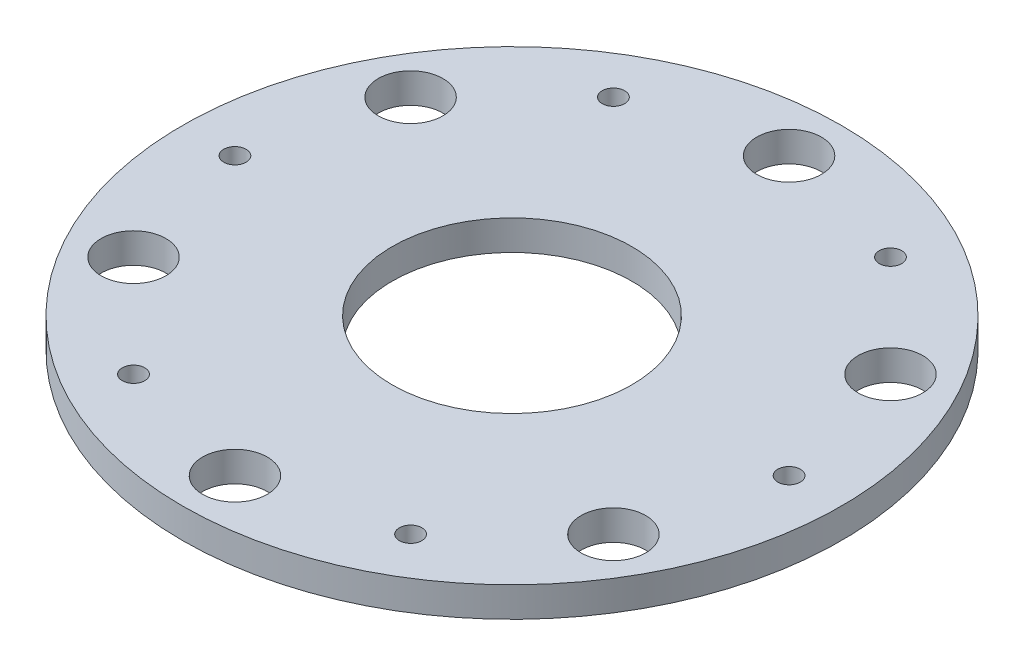
ISO-10303-21;
HEADER;
FILE_DESCRIPTION(('STEP AP214'),'2;1');
FILE_NAME('part.step','',(''),(''),'','','');
FILE_SCHEMA(('AUTOMOTIVE_DESIGN { 1 0 10303 214 1 1 1 1 }'));
ENDSEC;
DATA;
#1=APPLICATION_CONTEXT('core data for automotive mechanical design processes');
#2=APPLICATION_PROTOCOL_DEFINITION('international standard','automotive_design',2000,#1);
#3=PRODUCT_CONTEXT('',#1,'mechanical');
#4=PRODUCT('Part','Part','',(#3));
#5=PRODUCT_RELATED_PRODUCT_CATEGORY('part','',(#4));
#6=PRODUCT_DEFINITION_FORMATION('','',#4);
#7=PRODUCT_DEFINITION_CONTEXT('part definition',#1,'design');
#8=PRODUCT_DEFINITION('design','',#6,#7);
#9=PRODUCT_DEFINITION_SHAPE('','',#8);
#10=(LENGTH_UNIT() NAMED_UNIT(*) SI_UNIT(.MILLI.,.METRE.));
#11=(NAMED_UNIT(*) PLANE_ANGLE_UNIT() SI_UNIT($,.RADIAN.));
#12=(NAMED_UNIT(*) SI_UNIT($,.STERADIAN.) SOLID_ANGLE_UNIT());
#13=UNCERTAINTY_MEASURE_WITH_UNIT(LENGTH_MEASURE(1.E-05),#10,'distance_accuracy_value','');
#14=(GEOMETRIC_REPRESENTATION_CONTEXT(3) GLOBAL_UNCERTAINTY_ASSIGNED_CONTEXT((#13)) GLOBAL_UNIT_ASSIGNED_CONTEXT((#10,
#11,#12)) REPRESENTATION_CONTEXT('',''));
#15=CARTESIAN_POINT('',(0.,0.,0.));
#16=DIRECTION('',(0.,0.,1.));
#17=DIRECTION('',(1.,0.,0.));
#18=AXIS2_PLACEMENT_3D('',#15,#16,#17);
#19=CARTESIAN_POINT('',(0.,0.,0.));
#20=DIRECTION('',(0.,1.,0.));
#21=DIRECTION('',(0.,0.,1.));
#22=AXIS2_PLACEMENT_3D('',#19,#20,#21);
#23=PLANE('',#22);
#24=CARTESIAN_POINT('',(14.6811999999997,0.,-25.4285843160804));
#25=DIRECTION('',(0.,-1.,0.));
#26=DIRECTION('',(0.,0.,-1.));
#27=AXIS2_PLACEMENT_3D('',#24,#25,#26);
#28=CIRCLE('',#27,1.19125999999999);
#29=CARTESIAN_POINT('',(14.6811999999997,0.,-26.6198443160804));
#30=VERTEX_POINT('',#29);
#31=EDGE_CURVE('E197',#30,#30,#28,.T.);
#32=ORIENTED_EDGE('',*,*,#31,.F.);
#33=EDGE_LOOP('',(#32));
#34=FACE_BOUND('',#33,.T.);
#35=CARTESIAN_POINT('',(14.6812,0.,25.4285843160802));
#36=DIRECTION('',(0.,-1.,0.));
#37=DIRECTION('',(0.,0.,-1.));
#38=AXIS2_PLACEMENT_3D('',#35,#36,#37);
#39=CIRCLE('',#38,1.19125999999999);
#40=CARTESIAN_POINT('',(14.6812,0.,24.2373243160802));
#41=VERTEX_POINT('',#40);
#42=EDGE_CURVE('E194',#41,#41,#39,.T.);
#43=ORIENTED_EDGE('',*,*,#42,.F.);
#44=EDGE_LOOP('',(#43));
#45=FACE_BOUND('',#44,.T.);
#46=CARTESIAN_POINT('',(-14.6812,0.,-25.4285843160802));
#47=DIRECTION('',(0.,-1.,0.));
#48=DIRECTION('',(0.,0.,-1.));
#49=AXIS2_PLACEMENT_3D('',#46,#47,#48);
#50=CIRCLE('',#49,1.19125999999999);
#51=CARTESIAN_POINT('',(-14.6812,0.,-26.6198443160802));
#52=VERTEX_POINT('',#51);
#53=EDGE_CURVE('E219',#52,#52,#50,.T.);
#54=ORIENTED_EDGE('',*,*,#53,.F.);
#55=EDGE_LOOP('',(#54));
#56=FACE_BOUND('',#55,.T.);
#57=CARTESIAN_POINT('',(25.4285843160815,0.,14.6811999999993));
#58=DIRECTION('',(0.,1.,0.));
#59=DIRECTION('',(0.,0.,1.));
#60=AXIS2_PLACEMENT_3D('',#57,#58,#59);
#61=CIRCLE('',#60,3.429);
#62=CARTESIAN_POINT('',(25.4285843160815,0.,18.1101999999993));
#63=VERTEX_POINT('',#62);
#64=EDGE_CURVE('E58',#63,#63,#61,.T.);
#65=ORIENTED_EDGE('',*,*,#64,.T.);
#66=EDGE_LOOP('',(#65));
#67=FACE_BOUND('',#66,.T.);
#68=CARTESIAN_POINT('',(1.66399715291634E-12,0.,29.3624));
#69=DIRECTION('',(0.,1.,0.));
#70=DIRECTION('',(0.,0.,1.));
#71=AXIS2_PLACEMENT_3D('',#68,#69,#70);
#72=CIRCLE('',#71,3.429);
#73=CARTESIAN_POINT('',(1.66399715291634E-12,0.,32.7914));
#74=VERTEX_POINT('',#73);
#75=EDGE_CURVE('E62',#74,#74,#72,.T.);
#76=ORIENTED_EDGE('',*,*,#75,.T.);
#77=EDGE_LOOP('',(#76));
#78=FACE_BOUND('',#77,.T.);
#79=CARTESIAN_POINT('',(-25.4285843160789,0.,14.6812000000007));
#80=DIRECTION('',(0.,1.,0.));
#81=DIRECTION('',(0.,0.,1.));
#82=AXIS2_PLACEMENT_3D('',#79,#80,#81);
#83=CIRCLE('',#82,3.429);
#84=CARTESIAN_POINT('',(-25.4285843160789,0.,18.1102000000007));
#85=VERTEX_POINT('',#84);
#86=EDGE_CURVE('E67',#85,#85,#83,.T.);
#87=ORIENTED_EDGE('',*,*,#86,.T.);
#88=EDGE_LOOP('',(#87));
#89=FACE_BOUND('',#88,.T.);
#90=CARTESIAN_POINT('',(-25.4285843160798,0.,-14.6811999999993));
#91=DIRECTION('',(0.,1.,0.));
#92=DIRECTION('',(0.,0.,1.));
#93=AXIS2_PLACEMENT_3D('',#90,#91,#92);
#94=CIRCLE('',#93,3.429);
#95=CARTESIAN_POINT('',(-25.4285843160798,0.,-11.2521999999993));
#96=VERTEX_POINT('',#95);
#97=EDGE_CURVE('E71',#96,#96,#94,.T.);
#98=ORIENTED_EDGE('',*,*,#97,.T.);
#99=EDGE_LOOP('',(#98));
#100=FACE_BOUND('',#99,.T.);
#101=CARTESIAN_POINT('',(0.,0.,-29.3624));
#102=DIRECTION('',(0.,1.,0.));
#103=DIRECTION('',(0.,0.,1.));
#104=AXIS2_PLACEMENT_3D('',#101,#102,#103);
#105=CIRCLE('',#104,3.429);
#106=CARTESIAN_POINT('',(0.,0.,-25.9334));
#107=VERTEX_POINT('',#106);
#108=EDGE_CURVE('E75',#107,#107,#105,.T.);
#109=ORIENTED_EDGE('',*,*,#108,.T.);
#110=EDGE_LOOP('',(#109));
#111=FACE_BOUND('',#110,.T.);
#112=CARTESIAN_POINT('',(25.4285843160806,0.,-14.6812000000007));
#113=DIRECTION('',(0.,1.,0.));
#114=DIRECTION('',(0.,0.,1.));
#115=AXIS2_PLACEMENT_3D('',#112,#113,#114);
#116=CIRCLE('',#115,3.429);
#117=CARTESIAN_POINT('',(25.4285843160806,0.,-11.2522000000007));
#118=VERTEX_POINT('',#117);
#119=EDGE_CURVE('E79',#118,#118,#116,.T.);
#120=ORIENTED_EDGE('',*,*,#119,.T.);
#121=EDGE_LOOP('',(#120));
#122=FACE_BOUND('',#121,.T.);
#123=CARTESIAN_POINT('',(0.,0.,0.));
#124=DIRECTION('',(0.,1.,0.));
#125=DIRECTION('',(0.,0.,1.));
#126=AXIS2_PLACEMENT_3D('',#123,#124,#125);
#127=CIRCLE('',#126,34.925);
#128=CARTESIAN_POINT('',(0.,0.,34.925));
#129=VERTEX_POINT('',#128);
#130=EDGE_CURVE('E82',#129,#129,#127,.T.);
#131=ORIENTED_EDGE('',*,*,#130,.F.);
#132=EDGE_LOOP('',(#131));
#133=FACE_BOUND('',#132,.T.);
#134=CARTESIAN_POINT('',(0.,0.,0.));
#135=DIRECTION('',(0.,1.,0.));
#136=DIRECTION('',(0.,0.,1.));
#137=AXIS2_PLACEMENT_3D('',#134,#135,#136);
#138=CIRCLE('',#137,12.7);
#139=CARTESIAN_POINT('',(0.,0.,12.7));
#140=VERTEX_POINT('',#139);
#141=EDGE_CURVE('E43',#140,#140,#138,.T.);
#142=ORIENTED_EDGE('',*,*,#141,.T.);
#143=EDGE_LOOP('',(#142));
#144=FACE_BOUND('',#143,.T.);
#145=CARTESIAN_POINT('',(-29.3624,0.,1.07552855510562E-13));
#146=DIRECTION('',(0.,-1.,0.));
#147=DIRECTION('',(0.,0.,-1.));
#148=AXIS2_PLACEMENT_3D('',#145,#146,#147);
#149=CIRCLE('',#148,1.19125999999999);
#150=CARTESIAN_POINT('',(-29.3624,0.,-1.19125999999988));
#151=VERTEX_POINT('',#150);
#152=EDGE_CURVE('E178',#151,#151,#149,.T.);
#153=ORIENTED_EDGE('',*,*,#152,.F.);
#154=EDGE_LOOP('',(#153));
#155=FACE_BOUND('',#154,.T.);
#156=CARTESIAN_POINT('',(-14.6811999999998,0.,25.4285843160803));
#157=DIRECTION('',(0.,-1.,0.));
#158=DIRECTION('',(0.,0.,-1.));
#159=AXIS2_PLACEMENT_3D('',#156,#157,#158);
#160=CIRCLE('',#159,1.19125999999999);
#161=CARTESIAN_POINT('',(-14.6811999999998,0.,24.2373243160803));
#162=VERTEX_POINT('',#161);
#163=EDGE_CURVE('E182',#162,#162,#160,.T.);
#164=ORIENTED_EDGE('',*,*,#163,.F.);
#165=EDGE_LOOP('',(#164));
#166=FACE_BOUND('',#165,.T.);
#167=CARTESIAN_POINT('',(29.3624,0.,-3.13984949151802E-13));
#168=DIRECTION('',(0.,-1.,0.));
#169=DIRECTION('',(0.,0.,-1.));
#170=AXIS2_PLACEMENT_3D('',#167,#168,#169);
#171=CIRCLE('',#170,1.19125999999999);
#172=CARTESIAN_POINT('',(29.3624,0.,-1.1912600000003));
#173=VERTEX_POINT('',#172);
#174=EDGE_CURVE('E185',#173,#173,#171,.T.);
#175=ORIENTED_EDGE('',*,*,#174,.F.);
#176=EDGE_LOOP('',(#175));
#177=FACE_BOUND('',#176,.T.);
#178=ADVANCED_FACE('F39',(#34,#45,#56,#67,#78,#89,#100,#111,#122,#133,#144,#155,#166,#177),#23,.F.);
#179=CARTESIAN_POINT('',(0.,3.175,0.));
#180=DIRECTION('',(0.,-1.,0.));
#181=DIRECTION('',(0.,0.,-1.));
#182=AXIS2_PLACEMENT_3D('',#179,#180,#181);
#183=CYLINDRICAL_SURFACE('',#182,34.925);
#184=CARTESIAN_POINT('',(0.,3.175,0.));
#185=DIRECTION('',(0.,1.,0.));
#186=DIRECTION('',(0.,0.,1.));
#187=AXIS2_PLACEMENT_3D('',#184,#185,#186);
#188=CIRCLE('',#187,34.925);
#189=CARTESIAN_POINT('',(0.,3.175,34.925));
#190=VERTEX_POINT('',#189);
#191=EDGE_CURVE('E48',#190,#190,#188,.T.);
#192=ORIENTED_EDGE('',*,*,#191,.F.);
#193=EDGE_LOOP('',(#192));
#194=FACE_BOUND('',#193,.T.);
#195=ORIENTED_EDGE('',*,*,#130,.T.);
#196=EDGE_LOOP('',(#195));
#197=FACE_BOUND('',#196,.T.);
#198=ADVANCED_FACE('F132',(#194,#197),#183,.T.);
#199=CARTESIAN_POINT('',(25.4285843160806,3.175,-14.6812000000007));
#200=DIRECTION('',(0.,-1.,0.));
#201=DIRECTION('',(0.,0.,-1.));
#202=AXIS2_PLACEMENT_3D('',#199,#200,#201);
#203=CYLINDRICAL_SURFACE('',#202,3.429);
#204=CARTESIAN_POINT('',(25.4285843160806,3.175,-14.6812000000007));
#205=DIRECTION('',(0.,1.,0.));
#206=DIRECTION('',(0.,0.,1.));
#207=AXIS2_PLACEMENT_3D('',#204,#205,#206);
#208=CIRCLE('',#207,3.429);
#209=CARTESIAN_POINT('',(25.4285843160806,3.175,-11.2522000000007));
#210=VERTEX_POINT('',#209);
#211=EDGE_CURVE('E54',#210,#210,#208,.T.);
#212=ORIENTED_EDGE('',*,*,#211,.T.);
#213=EDGE_LOOP('',(#212));
#214=FACE_BOUND('',#213,.T.);
#215=ORIENTED_EDGE('',*,*,#119,.F.);
#216=EDGE_LOOP('',(#215));
#217=FACE_BOUND('',#216,.T.);
#218=ADVANCED_FACE('F119',(#214,#217),#203,.F.);
#219=CARTESIAN_POINT('',(0.,3.175,-29.3624));
#220=DIRECTION('',(0.,-1.,0.));
#221=DIRECTION('',(0.,0.,-1.));
#222=AXIS2_PLACEMENT_3D('',#219,#220,#221);
#223=CYLINDRICAL_SURFACE('',#222,3.429);
#224=CARTESIAN_POINT('',(0.,3.175,-29.3624));
#225=DIRECTION('',(0.,1.,0.));
#226=DIRECTION('',(0.,0.,1.));
#227=AXIS2_PLACEMENT_3D('',#224,#225,#226);
#228=CIRCLE('',#227,3.429);
#229=CARTESIAN_POINT('',(0.,3.175,-25.9334));
#230=VERTEX_POINT('',#229);
#231=EDGE_CURVE('E112',#230,#230,#228,.T.);
#232=ORIENTED_EDGE('',*,*,#231,.T.);
#233=EDGE_LOOP('',(#232));
#234=FACE_BOUND('',#233,.T.);
#235=ORIENTED_EDGE('',*,*,#108,.F.);
#236=EDGE_LOOP('',(#235));
#237=FACE_BOUND('',#236,.T.);
#238=ADVANCED_FACE('F139',(#234,#237),#223,.F.);
#239=CARTESIAN_POINT('',(-25.4285843160798,3.175,-14.6811999999993));
#240=DIRECTION('',(0.,-1.,0.));
#241=DIRECTION('',(0.,0.,-1.));
#242=AXIS2_PLACEMENT_3D('',#239,#240,#241);
#243=CYLINDRICAL_SURFACE('',#242,3.429);
#244=CARTESIAN_POINT('',(-25.4285843160798,3.175,-14.6811999999993));
#245=DIRECTION('',(0.,1.,0.));
#246=DIRECTION('',(0.,0.,1.));
#247=AXIS2_PLACEMENT_3D('',#244,#245,#246);
#248=CIRCLE('',#247,3.429);
#249=CARTESIAN_POINT('',(-25.4285843160798,3.175,-11.2521999999993));
#250=VERTEX_POINT('',#249);
#251=EDGE_CURVE('E108',#250,#250,#248,.T.);
#252=ORIENTED_EDGE('',*,*,#251,.T.);
#253=EDGE_LOOP('',(#252));
#254=FACE_BOUND('',#253,.T.);
#255=ORIENTED_EDGE('',*,*,#97,.F.);
#256=EDGE_LOOP('',(#255));
#257=FACE_BOUND('',#256,.T.);
#258=ADVANCED_FACE('F147',(#254,#257),#243,.F.);
#259=CARTESIAN_POINT('',(-25.4285843160789,3.175,14.6812000000007));
#260=DIRECTION('',(0.,-1.,0.));
#261=DIRECTION('',(0.,0.,-1.));
#262=AXIS2_PLACEMENT_3D('',#259,#260,#261);
#263=CYLINDRICAL_SURFACE('',#262,3.429);
#264=CARTESIAN_POINT('',(-25.4285843160789,3.175,14.6812000000007));
#265=DIRECTION('',(0.,1.,0.));
#266=DIRECTION('',(0.,0.,1.));
#267=AXIS2_PLACEMENT_3D('',#264,#265,#266);
#268=CIRCLE('',#267,3.429);
#269=CARTESIAN_POINT('',(-25.4285843160789,3.175,18.1102000000007));
#270=VERTEX_POINT('',#269);
#271=EDGE_CURVE('E100',#270,#270,#268,.T.);
#272=ORIENTED_EDGE('',*,*,#271,.T.);
#273=EDGE_LOOP('',(#272));
#274=FACE_BOUND('',#273,.T.);
#275=ORIENTED_EDGE('',*,*,#86,.F.);
#276=EDGE_LOOP('',(#275));
#277=FACE_BOUND('',#276,.T.);
#278=ADVANCED_FACE('F151',(#274,#277),#263,.F.);
#279=CARTESIAN_POINT('',(1.66399715291634E-12,3.175,29.3624));
#280=DIRECTION('',(0.,-1.,0.));
#281=DIRECTION('',(0.,0.,-1.));
#282=AXIS2_PLACEMENT_3D('',#279,#280,#281);
#283=CYLINDRICAL_SURFACE('',#282,3.429);
#284=CARTESIAN_POINT('',(1.66399715291634E-12,3.175,29.3624));
#285=DIRECTION('',(0.,1.,0.));
#286=DIRECTION('',(0.,0.,1.));
#287=AXIS2_PLACEMENT_3D('',#284,#285,#286);
#288=CIRCLE('',#287,3.429);
#289=CARTESIAN_POINT('',(1.66399715291634E-12,3.175,32.7914));
#290=VERTEX_POINT('',#289);
#291=EDGE_CURVE('E94',#290,#290,#288,.T.);
#292=ORIENTED_EDGE('',*,*,#291,.T.);
#293=EDGE_LOOP('',(#292));
#294=FACE_BOUND('',#293,.T.);
#295=ORIENTED_EDGE('',*,*,#75,.F.);
#296=EDGE_LOOP('',(#295));
#297=FACE_BOUND('',#296,.T.);
#298=ADVANCED_FACE('F154',(#294,#297),#283,.F.);
#299=CARTESIAN_POINT('',(25.4285843160815,3.175,14.6811999999993));
#300=DIRECTION('',(0.,-1.,0.));
#301=DIRECTION('',(0.,0.,-1.));
#302=AXIS2_PLACEMENT_3D('',#299,#300,#301);
#303=CYLINDRICAL_SURFACE('',#302,3.429);
#304=CARTESIAN_POINT('',(25.4285843160815,3.175,14.6811999999993));
#305=DIRECTION('',(0.,1.,0.));
#306=DIRECTION('',(0.,0.,1.));
#307=AXIS2_PLACEMENT_3D('',#304,#305,#306);
#308=CIRCLE('',#307,3.429);
#309=CARTESIAN_POINT('',(25.4285843160815,3.175,18.1101999999993));
#310=VERTEX_POINT('',#309);
#311=EDGE_CURVE('E89',#310,#310,#308,.T.);
#312=ORIENTED_EDGE('',*,*,#311,.T.);
#313=EDGE_LOOP('',(#312));
#314=FACE_BOUND('',#313,.T.);
#315=ORIENTED_EDGE('',*,*,#64,.F.);
#316=EDGE_LOOP('',(#315));
#317=FACE_BOUND('',#316,.T.);
#318=ADVANCED_FACE('F41',(#314,#317),#303,.F.);
#319=CARTESIAN_POINT('',(0.,3.175,0.));
#320=DIRECTION('',(0.,-1.,0.));
#321=DIRECTION('',(0.,0.,-1.));
#322=AXIS2_PLACEMENT_3D('',#319,#320,#321);
#323=CYLINDRICAL_SURFACE('',#322,12.7);
#324=CARTESIAN_POINT('',(0.,3.175,0.));
#325=DIRECTION('',(0.,1.,0.));
#326=DIRECTION('',(0.,0.,1.));
#327=AXIS2_PLACEMENT_3D('',#324,#325,#326);
#328=CIRCLE('',#327,12.7);
#329=CARTESIAN_POINT('',(0.,3.175,12.7));
#330=VERTEX_POINT('',#329);
#331=EDGE_CURVE('E10',#330,#330,#328,.T.);
#332=ORIENTED_EDGE('',*,*,#331,.T.);
#333=EDGE_LOOP('',(#332));
#334=FACE_BOUND('',#333,.T.);
#335=ORIENTED_EDGE('',*,*,#141,.F.);
#336=EDGE_LOOP('',(#335));
#337=FACE_BOUND('',#336,.T.);
#338=ADVANCED_FACE('F126',(#334,#337),#323,.F.);
#339=CARTESIAN_POINT('',(0.,3.175,0.));
#340=DIRECTION('',(0.,1.,0.));
#341=DIRECTION('',(0.,0.,1.));
#342=AXIS2_PLACEMENT_3D('',#339,#340,#341);
#343=PLANE('',#342);
#344=CARTESIAN_POINT('',(14.6811999999997,3.175,-25.4285843160804));
#345=DIRECTION('',(0.,-1.,0.));
#346=DIRECTION('',(0.,0.,-1.));
#347=AXIS2_PLACEMENT_3D('',#344,#345,#346);
#348=CIRCLE('',#347,1.19126);
#349=CARTESIAN_POINT('',(14.6811999999997,3.175,-26.6198443160804));
#350=VERTEX_POINT('',#349);
#351=EDGE_CURVE('E189',#350,#350,#348,.T.);
#352=ORIENTED_EDGE('',*,*,#351,.T.);
#353=EDGE_LOOP('',(#352));
#354=FACE_BOUND('',#353,.T.);
#355=CARTESIAN_POINT('',(29.3624,3.175,-3.13984949151802E-13));
#356=DIRECTION('',(0.,-1.,0.));
#357=DIRECTION('',(0.,0.,-1.));
#358=AXIS2_PLACEMENT_3D('',#355,#356,#357);
#359=CIRCLE('',#358,1.19126);
#360=CARTESIAN_POINT('',(29.3624,3.175,-1.19126000000031));
#361=VERTEX_POINT('',#360);
#362=EDGE_CURVE('E188',#361,#361,#359,.T.);
#363=ORIENTED_EDGE('',*,*,#362,.T.);
#364=EDGE_LOOP('',(#363));
#365=FACE_BOUND('',#364,.T.);
#366=CARTESIAN_POINT('',(14.6812,3.175,25.4285843160802));
#367=DIRECTION('',(0.,-1.,0.));
#368=DIRECTION('',(0.,0.,-1.));
#369=AXIS2_PLACEMENT_3D('',#366,#367,#368);
#370=CIRCLE('',#369,1.19126);
#371=CARTESIAN_POINT('',(14.6812,3.175,24.2373243160802));
#372=VERTEX_POINT('',#371);
#373=EDGE_CURVE('E204',#372,#372,#370,.T.);
#374=ORIENTED_EDGE('',*,*,#373,.T.);
#375=EDGE_LOOP('',(#374));
#376=FACE_BOUND('',#375,.T.);
#377=CARTESIAN_POINT('',(-14.6811999999998,3.175,25.4285843160803));
#378=DIRECTION('',(0.,-1.,0.));
#379=DIRECTION('',(0.,0.,-1.));
#380=AXIS2_PLACEMENT_3D('',#377,#378,#379);
#381=CIRCLE('',#380,1.19126);
#382=CARTESIAN_POINT('',(-14.6811999999998,3.175,24.2373243160803));
#383=VERTEX_POINT('',#382);
#384=EDGE_CURVE('E210',#383,#383,#381,.T.);
#385=ORIENTED_EDGE('',*,*,#384,.T.);
#386=EDGE_LOOP('',(#385));
#387=FACE_BOUND('',#386,.T.);
#388=CARTESIAN_POINT('',(-29.3624,3.175,1.07552855510562E-13));
#389=DIRECTION('',(0.,-1.,0.));
#390=DIRECTION('',(0.,0.,-1.));
#391=AXIS2_PLACEMENT_3D('',#388,#389,#390);
#392=CIRCLE('',#391,1.19126);
#393=CARTESIAN_POINT('',(-29.3624,3.175,-1.19125999999989));
#394=VERTEX_POINT('',#393);
#395=EDGE_CURVE('E216',#394,#394,#392,.T.);
#396=ORIENTED_EDGE('',*,*,#395,.T.);
#397=EDGE_LOOP('',(#396));
#398=FACE_BOUND('',#397,.T.);
#399=CARTESIAN_POINT('',(-14.6812,3.175,-25.4285843160802));
#400=DIRECTION('',(0.,-1.,0.));
#401=DIRECTION('',(0.,0.,-1.));
#402=AXIS2_PLACEMENT_3D('',#399,#400,#401);
#403=CIRCLE('',#402,1.19126);
#404=CARTESIAN_POINT('',(-14.6812,3.175,-26.6198443160802));
#405=VERTEX_POINT('',#404);
#406=EDGE_CURVE('E63',#405,#405,#403,.T.);
#407=ORIENTED_EDGE('',*,*,#406,.T.);
#408=EDGE_LOOP('',(#407));
#409=FACE_BOUND('',#408,.T.);
#410=ORIENTED_EDGE('',*,*,#311,.F.);
#411=EDGE_LOOP('',(#410));
#412=FACE_BOUND('',#411,.T.);
#413=ORIENTED_EDGE('',*,*,#291,.F.);
#414=EDGE_LOOP('',(#413));
#415=FACE_BOUND('',#414,.T.);
#416=ORIENTED_EDGE('',*,*,#271,.F.);
#417=EDGE_LOOP('',(#416));
#418=FACE_BOUND('',#417,.T.);
#419=ORIENTED_EDGE('',*,*,#251,.F.);
#420=EDGE_LOOP('',(#419));
#421=FACE_BOUND('',#420,.T.);
#422=ORIENTED_EDGE('',*,*,#231,.F.);
#423=EDGE_LOOP('',(#422));
#424=FACE_BOUND('',#423,.T.);
#425=ORIENTED_EDGE('',*,*,#211,.F.);
#426=EDGE_LOOP('',(#425));
#427=FACE_BOUND('',#426,.T.);
#428=ORIENTED_EDGE('',*,*,#191,.T.);
#429=EDGE_LOOP('',(#428));
#430=FACE_BOUND('',#429,.T.);
#431=ORIENTED_EDGE('',*,*,#331,.F.);
#432=EDGE_LOOP('',(#431));
#433=FACE_BOUND('',#432,.T.);
#434=ADVANCED_FACE('F122',(#354,#365,#376,#387,#398,#409,#412,#415,#418,#421,#424,#427,#430,
#433),#343,.T.);
#435=CARTESIAN_POINT('',(-14.6812,0.,-25.4285843160802));
#436=DIRECTION('',(0.,-1.,0.));
#437=DIRECTION('',(0.,0.,-1.));
#438=AXIS2_PLACEMENT_3D('',#435,#436,#437);
#439=CYLINDRICAL_SURFACE('',#438,1.19125999999999);
#440=ORIENTED_EDGE('',*,*,#406,.F.);
#441=EDGE_LOOP('',(#440));
#442=FACE_BOUND('',#441,.T.);
#443=ORIENTED_EDGE('',*,*,#53,.T.);
#444=EDGE_LOOP('',(#443));
#445=FACE_BOUND('',#444,.T.);
#446=ADVANCED_FACE('F125',(#442,#445),#439,.F.);
#447=CARTESIAN_POINT('',(-29.3624,0.,1.07552855510562E-13));
#448=DIRECTION('',(0.,-1.,0.));
#449=DIRECTION('',(0.,0.,-1.));
#450=AXIS2_PLACEMENT_3D('',#447,#448,#449);
#451=CYLINDRICAL_SURFACE('',#450,1.19125999999999);
#452=ORIENTED_EDGE('',*,*,#395,.F.);
#453=EDGE_LOOP('',(#452));
#454=FACE_BOUND('',#453,.T.);
#455=ORIENTED_EDGE('',*,*,#152,.T.);
#456=EDGE_LOOP('',(#455));
#457=FACE_BOUND('',#456,.T.);
#458=ADVANCED_FACE('F231',(#454,#457),#451,.F.);
#459=CARTESIAN_POINT('',(-14.6811999999998,0.,25.4285843160803));
#460=DIRECTION('',(0.,-1.,0.));
#461=DIRECTION('',(0.,0.,-1.));
#462=AXIS2_PLACEMENT_3D('',#459,#460,#461);
#463=CYLINDRICAL_SURFACE('',#462,1.19125999999999);
#464=ORIENTED_EDGE('',*,*,#384,.F.);
#465=EDGE_LOOP('',(#464));
#466=FACE_BOUND('',#465,.T.);
#467=ORIENTED_EDGE('',*,*,#163,.T.);
#468=EDGE_LOOP('',(#467));
#469=FACE_BOUND('',#468,.T.);
#470=ADVANCED_FACE('F236',(#466,#469),#463,.F.);
#471=CARTESIAN_POINT('',(14.6812,0.,25.4285843160802));
#472=DIRECTION('',(0.,-1.,0.));
#473=DIRECTION('',(0.,0.,-1.));
#474=AXIS2_PLACEMENT_3D('',#471,#472,#473);
#475=CYLINDRICAL_SURFACE('',#474,1.19125999999999);
#476=ORIENTED_EDGE('',*,*,#373,.F.);
#477=EDGE_LOOP('',(#476));
#478=FACE_BOUND('',#477,.T.);
#479=ORIENTED_EDGE('',*,*,#42,.T.);
#480=EDGE_LOOP('',(#479));
#481=FACE_BOUND('',#480,.T.);
#482=ADVANCED_FACE('F242',(#478,#481),#475,.F.);
#483=CARTESIAN_POINT('',(29.3624,0.,-3.13984949151802E-13));
#484=DIRECTION('',(0.,-1.,0.));
#485=DIRECTION('',(0.,0.,-1.));
#486=AXIS2_PLACEMENT_3D('',#483,#484,#485);
#487=CYLINDRICAL_SURFACE('',#486,1.19125999999999);
#488=ORIENTED_EDGE('',*,*,#362,.F.);
#489=EDGE_LOOP('',(#488));
#490=FACE_BOUND('',#489,.T.);
#491=ORIENTED_EDGE('',*,*,#174,.T.);
#492=EDGE_LOOP('',(#491));
#493=FACE_BOUND('',#492,.T.);
#494=ADVANCED_FACE('F246',(#490,#493),#487,.F.);
#495=CARTESIAN_POINT('',(14.6811999999997,0.,-25.4285843160804));
#496=DIRECTION('',(0.,-1.,0.));
#497=DIRECTION('',(0.,0.,-1.));
#498=AXIS2_PLACEMENT_3D('',#495,#496,#497);
#499=CYLINDRICAL_SURFACE('',#498,1.19125999999999);
#500=ORIENTED_EDGE('',*,*,#351,.F.);
#501=EDGE_LOOP('',(#500));
#502=FACE_BOUND('',#501,.T.);
#503=ORIENTED_EDGE('',*,*,#31,.T.);
#504=EDGE_LOOP('',(#503));
#505=FACE_BOUND('',#504,.T.);
#506=ADVANCED_FACE('F250',(#502,#505),#499,.F.);
#507=CLOSED_SHELL('',(#178,#198,#218,#238,#258,#278,#298,#318,#338,#434,#446,#458,#470,#482,
#494,#506));
#508=MANIFOLD_SOLID_BREP('B2',#507);
#509=ADVANCED_BREP_SHAPE_REPRESENTATION('',(#18,#508),#14);
#510=SHAPE_DEFINITION_REPRESENTATION(#9,#509);
ENDSEC;
END-ISO-10303-21;
